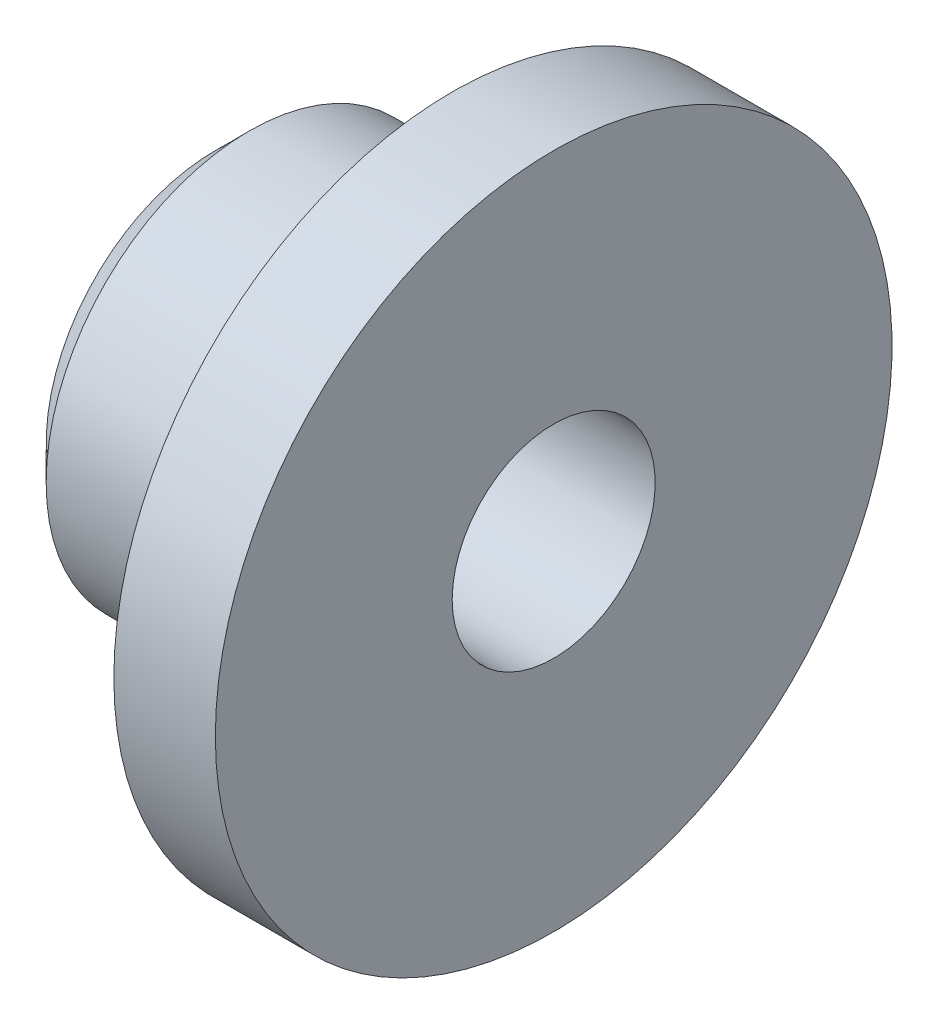
ISO-10303-21;
HEADER;
FILE_DESCRIPTION(('STEP AP214'),'2;1');
FILE_NAME('part.step','',(''),(''),'','','');
FILE_SCHEMA(('AUTOMOTIVE_DESIGN { 1 0 10303 214 1 1 1 1 }'));
ENDSEC;
DATA;
#1=APPLICATION_CONTEXT('core data for automotive mechanical design processes');
#2=APPLICATION_PROTOCOL_DEFINITION('international standard','automotive_design',2000,#1);
#3=PRODUCT_CONTEXT('',#1,'mechanical');
#4=PRODUCT('Part','Part','',(#3));
#5=PRODUCT_RELATED_PRODUCT_CATEGORY('part','',(#4));
#6=PRODUCT_DEFINITION_FORMATION('','',#4);
#7=PRODUCT_DEFINITION_CONTEXT('part definition',#1,'design');
#8=PRODUCT_DEFINITION('design','',#6,#7);
#9=PRODUCT_DEFINITION_SHAPE('','',#8);
#10=(LENGTH_UNIT() NAMED_UNIT(*) SI_UNIT(.MILLI.,.METRE.));
#11=(NAMED_UNIT(*) PLANE_ANGLE_UNIT() SI_UNIT($,.RADIAN.));
#12=(NAMED_UNIT(*) SI_UNIT($,.STERADIAN.) SOLID_ANGLE_UNIT());
#13=UNCERTAINTY_MEASURE_WITH_UNIT(LENGTH_MEASURE(1.E-05),#10,'distance_accuracy_value','');
#14=(GEOMETRIC_REPRESENTATION_CONTEXT(3) GLOBAL_UNCERTAINTY_ASSIGNED_CONTEXT((#13)) GLOBAL_UNIT_ASSIGNED_CONTEXT((#10,
#11,#12)) REPRESENTATION_CONTEXT('',''));
#15=CARTESIAN_POINT('',(0.,0.,0.));
#16=DIRECTION('',(0.,0.,1.));
#17=DIRECTION('',(1.,0.,0.));
#18=AXIS2_PLACEMENT_3D('',#15,#16,#17);
#19=CARTESIAN_POINT('',(-182.472480166851,39.8256182020782,-20.9809897447037));
#20=DIRECTION('',(-1.,0.,0.));
#21=DIRECTION('',(0.,0.,1.));
#22=AXIS2_PLACEMENT_3D('',#19,#20,#21);
#23=CYLINDRICAL_SURFACE('',#22,3.);
#24=CARTESIAN_POINT('',(-181.091924368006,39.8256182020782,-20.9809897447037));
#25=DIRECTION('',(1.,0.,0.));
#26=DIRECTION('',(0.,0.,-1.));
#27=AXIS2_PLACEMENT_3D('',#24,#25,#26);
#28=CIRCLE('',#27,3.);
#29=CARTESIAN_POINT('',(-181.091924368006,39.8256182020782,-23.9809897447037));
#30=VERTEX_POINT('',#29);
#31=EDGE_CURVE('E10',#30,#30,#28,.T.);
#32=ORIENTED_EDGE('',*,*,#31,.T.);
#33=EDGE_LOOP('',(#32));
#34=FACE_BOUND('',#33,.T.);
#35=CARTESIAN_POINT('',(-178.091924368006,39.8256182020782,-20.9809897447037));
#36=DIRECTION('',(-1.,0.,0.));
#37=DIRECTION('',(0.,0.,1.));
#38=AXIS2_PLACEMENT_3D('',#35,#36,#37);
#39=CIRCLE('',#38,3.);
#40=CARTESIAN_POINT('',(-178.091924368006,39.8256182020782,-17.9809897447037));
#41=VERTEX_POINT('',#40);
#42=EDGE_CURVE('E56',#41,#41,#39,.T.);
#43=ORIENTED_EDGE('',*,*,#42,.T.);
#44=EDGE_LOOP('',(#43));
#45=FACE_BOUND('',#44,.T.);
#46=ADVANCED_FACE('F30',(#34,#45),#23,.T.);
#47=CARTESIAN_POINT('',(-181.591924368006,36.8256182020782,-20.9809897447037));
#48=DIRECTION('',(1.,0.,0.));
#49=DIRECTION('',(0.,0.,-1.));
#50=AXIS2_PLACEMENT_3D('',#47,#48,#49);
#51=PLANE('',#50);
#52=CARTESIAN_POINT('',(-181.591924368006,39.8256182020782,-20.9809897447037));
#53=DIRECTION('',(1.,0.,0.));
#54=DIRECTION('',(0.,0.,-1.));
#55=AXIS2_PLACEMENT_3D('',#52,#53,#54);
#56=CIRCLE('',#55,2.50000000000001);
#57=CARTESIAN_POINT('',(-181.591924368006,39.8256182020782,-23.4809897447037));
#58=VERTEX_POINT('',#57);
#59=EDGE_CURVE('E37',#58,#58,#56,.F.);
#60=ORIENTED_EDGE('',*,*,#59,.T.);
#61=EDGE_LOOP('',(#60));
#62=FACE_BOUND('',#61,.T.);
#63=CARTESIAN_POINT('',(-181.591924368006,39.8256182020782,-20.9809897447037));
#64=DIRECTION('',(-1.,0.,0.));
#65=DIRECTION('',(0.,0.,1.));
#66=AXIS2_PLACEMENT_3D('',#63,#64,#65);
#67=CIRCLE('',#66,1.5);
#68=CARTESIAN_POINT('',(-181.591924368006,39.8256182020782,-19.4809897447037));
#69=VERTEX_POINT('',#68);
#70=EDGE_CURVE('E41',#69,#69,#67,.T.);
#71=ORIENTED_EDGE('',*,*,#70,.F.);
#72=EDGE_LOOP('',(#71));
#73=FACE_BOUND('',#72,.T.);
#74=ADVANCED_FACE('F82',(#62,#73),#51,.F.);
#75=CARTESIAN_POINT('',(-182.472480166851,39.8256182020782,-20.9809897447037));
#76=DIRECTION('',(-1.,0.,0.));
#77=DIRECTION('',(0.,0.,1.));
#78=AXIS2_PLACEMENT_3D('',#75,#76,#77);
#79=CYLINDRICAL_SURFACE('',#78,1.5);
#80=CARTESIAN_POINT('',(-176.591924368006,39.8256182020782,-20.9809897447037));
#81=DIRECTION('',(-1.,0.,0.));
#82=DIRECTION('',(0.,0.,1.));
#83=AXIS2_PLACEMENT_3D('',#80,#81,#82);
#84=CIRCLE('',#83,1.5);
#85=CARTESIAN_POINT('',(-176.591924368006,39.8256182020782,-19.4809897447037));
#86=VERTEX_POINT('',#85);
#87=EDGE_CURVE('E45',#86,#86,#84,.T.);
#88=ORIENTED_EDGE('',*,*,#87,.F.);
#89=EDGE_LOOP('',(#88));
#90=FACE_BOUND('',#89,.T.);
#91=ORIENTED_EDGE('',*,*,#70,.T.);
#92=EDGE_LOOP('',(#91));
#93=FACE_BOUND('',#92,.T.);
#94=ADVANCED_FACE('F76',(#90,#93),#79,.F.);
#95=CARTESIAN_POINT('',(-176.591924368006,38.3256182020782,-20.9809897447037));
#96=DIRECTION('',(-1.,0.,0.));
#97=DIRECTION('',(0.,0.,1.));
#98=AXIS2_PLACEMENT_3D('',#95,#96,#97);
#99=PLANE('',#98);
#100=CARTESIAN_POINT('',(-176.591924368006,39.8256182020782,-20.9809897447037));
#101=DIRECTION('',(-1.,0.,0.));
#102=DIRECTION('',(0.,0.,1.));
#103=AXIS2_PLACEMENT_3D('',#100,#101,#102);
#104=CIRCLE('',#103,5.);
#105=CARTESIAN_POINT('',(-176.591924368006,39.8256182020782,-15.9809897447037));
#106=VERTEX_POINT('',#105);
#107=EDGE_CURVE('E50',#106,#106,#104,.T.);
#108=ORIENTED_EDGE('',*,*,#107,.F.);
#109=EDGE_LOOP('',(#108));
#110=FACE_BOUND('',#109,.T.);
#111=ORIENTED_EDGE('',*,*,#87,.T.);
#112=EDGE_LOOP('',(#111));
#113=FACE_BOUND('',#112,.T.);
#114=ADVANCED_FACE('F70',(#110,#113),#99,.F.);
#115=CARTESIAN_POINT('',(-182.472480166851,39.8256182020782,-20.9809897447037));
#116=DIRECTION('',(-1.,0.,0.));
#117=DIRECTION('',(0.,0.,1.));
#118=AXIS2_PLACEMENT_3D('',#115,#116,#117);
#119=CYLINDRICAL_SURFACE('',#118,5.);
#120=CARTESIAN_POINT('',(-178.091924368006,39.8256182020782,-20.9809897447037));
#121=DIRECTION('',(-1.,0.,0.));
#122=DIRECTION('',(0.,0.,1.));
#123=AXIS2_PLACEMENT_3D('',#120,#121,#122);
#124=CIRCLE('',#123,5.);
#125=CARTESIAN_POINT('',(-178.091924368006,39.8256182020782,-15.9809897447037));
#126=VERTEX_POINT('',#125);
#127=EDGE_CURVE('E53',#126,#126,#124,.T.);
#128=ORIENTED_EDGE('',*,*,#127,.F.);
#129=EDGE_LOOP('',(#128));
#130=FACE_BOUND('',#129,.T.);
#131=ORIENTED_EDGE('',*,*,#107,.T.);
#132=EDGE_LOOP('',(#131));
#133=FACE_BOUND('',#132,.T.);
#134=ADVANCED_FACE('F64',(#130,#133),#119,.T.);
#135=CARTESIAN_POINT('',(-178.091924368006,36.8256182020782,-20.9809897447037));
#136=DIRECTION('',(1.,0.,0.));
#137=DIRECTION('',(0.,0.,-1.));
#138=AXIS2_PLACEMENT_3D('',#135,#136,#137);
#139=PLANE('',#138);
#140=ORIENTED_EDGE('',*,*,#42,.F.);
#141=EDGE_LOOP('',(#140));
#142=FACE_BOUND('',#141,.T.);
#143=ORIENTED_EDGE('',*,*,#127,.T.);
#144=EDGE_LOOP('',(#143));
#145=FACE_BOUND('',#144,.T.);
#146=ADVANCED_FACE('F61',(#142,#145),#139,.F.);
#147=CARTESIAN_POINT('',(-181.591924368006,39.8256182020782,-20.9809897447037));
#148=DIRECTION('',(1.,0.,0.));
#149=DIRECTION('',(0.,0.,-1.));
#150=AXIS2_PLACEMENT_3D('',#147,#148,#149);
#151=CONICAL_SURFACE('',#150,2.50000000000001,0.785398163397441);
#152=ORIENTED_EDGE('',*,*,#31,.F.);
#153=EDGE_LOOP('',(#152));
#154=FACE_BOUND('',#153,.T.);
#155=ORIENTED_EDGE('',*,*,#59,.F.);
#156=EDGE_LOOP('',(#155));
#157=FACE_BOUND('',#156,.T.);
#158=ADVANCED_FACE('F32',(#154,#157),#151,.T.);
#159=CLOSED_SHELL('',(#46,#74,#94,#114,#134,#146,#158));
#160=MANIFOLD_SOLID_BREP('B2',#159);
#161=ADVANCED_BREP_SHAPE_REPRESENTATION('',(#18,#160),#14);
#162=SHAPE_DEFINITION_REPRESENTATION(#9,#161);
ENDSEC;
END-ISO-10303-21;
